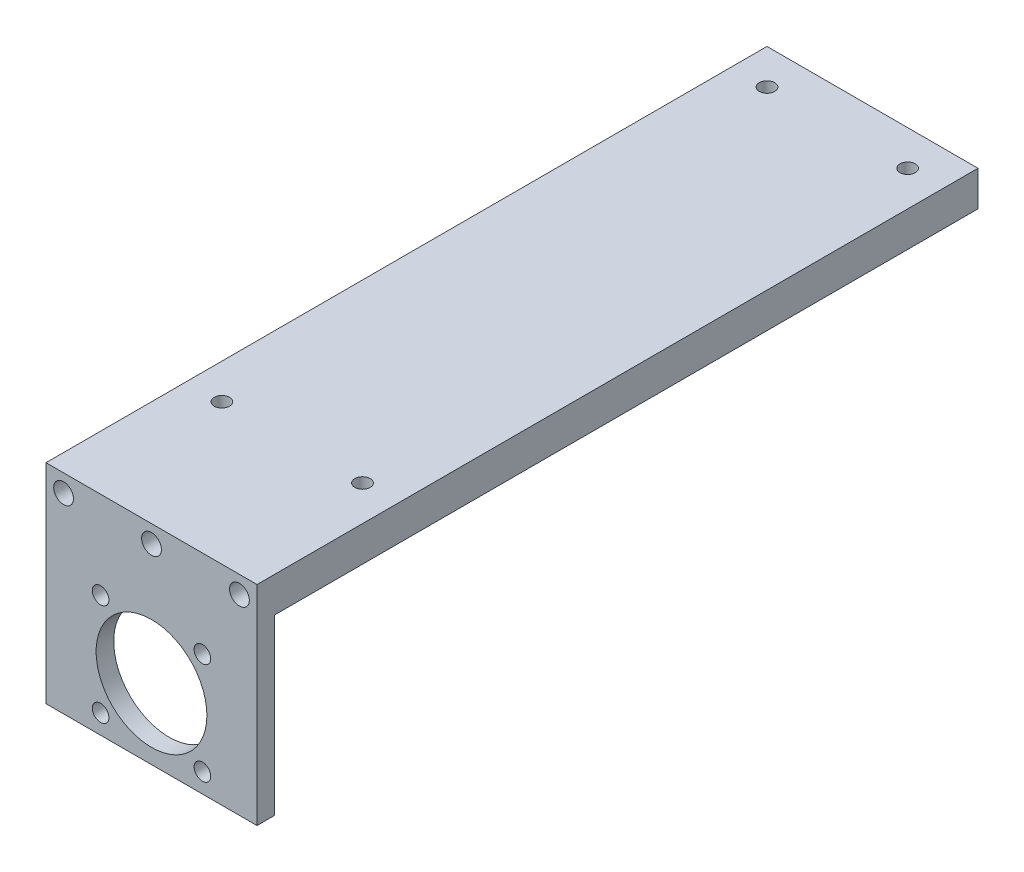
ISO-10303-21;
HEADER;
FILE_DESCRIPTION(('STEP AP214'),'2;1');
FILE_NAME('part.step','',(''),(''),'','','');
FILE_SCHEMA(('AUTOMOTIVE_DESIGN { 1 0 10303 214 1 1 1 1 }'));
ENDSEC;
DATA;
#1=APPLICATION_CONTEXT('core data for automotive mechanical design processes');
#2=APPLICATION_PROTOCOL_DEFINITION('international standard','automotive_design',2000,#1);
#3=PRODUCT_CONTEXT('',#1,'mechanical');
#4=PRODUCT('Part','Part','',(#3));
#5=PRODUCT_RELATED_PRODUCT_CATEGORY('part','',(#4));
#6=PRODUCT_DEFINITION_FORMATION('','',#4);
#7=PRODUCT_DEFINITION_CONTEXT('part definition',#1,'design');
#8=PRODUCT_DEFINITION('design','',#6,#7);
#9=PRODUCT_DEFINITION_SHAPE('','',#8);
#10=(LENGTH_UNIT() NAMED_UNIT(*) SI_UNIT(.MILLI.,.METRE.));
#11=(NAMED_UNIT(*) PLANE_ANGLE_UNIT() SI_UNIT($,.RADIAN.));
#12=(NAMED_UNIT(*) SI_UNIT($,.STERADIAN.) SOLID_ANGLE_UNIT());
#13=UNCERTAINTY_MEASURE_WITH_UNIT(LENGTH_MEASURE(1.E-05),#10,'distance_accuracy_value','');
#14=(GEOMETRIC_REPRESENTATION_CONTEXT(3) GLOBAL_UNCERTAINTY_ASSIGNED_CONTEXT((#13)) GLOBAL_UNIT_ASSIGNED_CONTEXT((#10,
#11,#12)) REPRESENTATION_CONTEXT('',''));
#15=CARTESIAN_POINT('',(0.,0.,0.));
#16=DIRECTION('',(0.,0.,1.));
#17=DIRECTION('',(1.,0.,0.));
#18=AXIS2_PLACEMENT_3D('',#15,#16,#17);
#19=CARTESIAN_POINT('',(0.,0.,3.175));
#20=DIRECTION('',(0.,0.,-1.));
#21=DIRECTION('',(-1.,0.,0.));
#22=AXIS2_PLACEMENT_3D('',#19,#20,#21);
#23=PLANE('',#22);
#24=DIRECTION('',(0.,1.,0.));
#25=VECTOR('',#24,1.);
#26=CARTESIAN_POINT('',(19.05,24.9936,3.175));
#27=LINE('',#26,#25);
#28=CARTESIAN_POINT('',(19.05,-12.7,3.175));
#29=VERTEX_POINT('',#28);
#30=CARTESIAN_POINT('',(19.05,24.9936,3.175));
#31=VERTEX_POINT('',#30);
#32=EDGE_CURVE('E196',#29,#31,#27,.T.);
#33=ORIENTED_EDGE('',*,*,#32,.T.);
#34=DIRECTION('',(-1.,0.,0.));
#35=VECTOR('',#34,1.);
#36=CARTESIAN_POINT('',(19.05,24.9936,3.175));
#37=LINE('',#36,#35);
#38=CARTESIAN_POINT('',(-19.05,24.9936,3.175));
#39=VERTEX_POINT('',#38);
#40=EDGE_CURVE('E86',#31,#39,#37,.T.);
#41=ORIENTED_EDGE('',*,*,#40,.T.);
#42=DIRECTION('',(0.,-1.,0.));
#43=VECTOR('',#42,1.);
#44=CARTESIAN_POINT('',(-19.05,24.9936,3.175));
#45=LINE('',#44,#43);
#46=CARTESIAN_POINT('',(-19.05,-12.7,3.175));
#47=VERTEX_POINT('',#46);
#48=EDGE_CURVE('E201',#39,#47,#45,.T.);
#49=ORIENTED_EDGE('',*,*,#48,.T.);
#50=DIRECTION('',(1.,0.,0.));
#51=VECTOR('',#50,1.);
#52=CARTESIAN_POINT('',(19.05,-12.7,3.175));
#53=LINE('',#52,#51);
#54=EDGE_CURVE('E64',#47,#29,#53,.T.);
#55=ORIENTED_EDGE('',*,*,#54,.T.);
#56=EDGE_LOOP('',(#33,#41,#49,#55));
#57=FACE_BOUND('',#56,.T.);
#58=CARTESIAN_POINT('',(15.875,21.8186,3.175));
#59=DIRECTION('',(0.,0.,1.));
#60=DIRECTION('',(1.,0.,0.));
#61=AXIS2_PLACEMENT_3D('',#58,#59,#60);
#62=CIRCLE('',#61,1.7859375);
#63=CARTESIAN_POINT('',(17.6609375,21.8186,3.175));
#64=VERTEX_POINT('',#63);
#65=EDGE_CURVE('E189',#64,#64,#62,.T.);
#66=ORIENTED_EDGE('',*,*,#65,.F.);
#67=EDGE_LOOP('',(#66));
#68=FACE_BOUND('',#67,.T.);
#69=CARTESIAN_POINT('',(0.,21.8186,3.175));
#70=DIRECTION('',(0.,0.,1.));
#71=DIRECTION('',(1.,0.,0.));
#72=AXIS2_PLACEMENT_3D('',#69,#70,#71);
#73=CIRCLE('',#72,1.7859375);
#74=CARTESIAN_POINT('',(1.7859375,21.8186,3.175));
#75=VERTEX_POINT('',#74);
#76=EDGE_CURVE('E181',#75,#75,#73,.T.);
#77=ORIENTED_EDGE('',*,*,#76,.F.);
#78=EDGE_LOOP('',(#77));
#79=FACE_BOUND('',#78,.T.);
#80=CARTESIAN_POINT('',(-15.875,21.8186,3.175));
#81=DIRECTION('',(0.,0.,1.));
#82=DIRECTION('',(1.,0.,0.));
#83=AXIS2_PLACEMENT_3D('',#80,#81,#82);
#84=CIRCLE('',#83,1.7859375);
#85=CARTESIAN_POINT('',(-14.0890625,21.8186,3.175));
#86=VERTEX_POINT('',#85);
#87=EDGE_CURVE('E173',#86,#86,#84,.T.);
#88=ORIENTED_EDGE('',*,*,#87,.F.);
#89=EDGE_LOOP('',(#88));
#90=FACE_BOUND('',#89,.T.);
#91=CARTESIAN_POINT('',(0.,0.,3.175));
#92=DIRECTION('',(0.,0.,1.));
#93=DIRECTION('',(1.,0.,0.));
#94=AXIS2_PLACEMENT_3D('',#91,#92,#93);
#95=CIRCLE('',#94,9.99999999999999);
#96=CARTESIAN_POINT('',(9.99999999999999,0.,3.175));
#97=VERTEX_POINT('',#96);
#98=EDGE_CURVE('E165',#97,#97,#95,.T.);
#99=ORIENTED_EDGE('',*,*,#98,.F.);
#100=EDGE_LOOP('',(#99));
#101=FACE_BOUND('',#100,.T.);
#102=CARTESIAN_POINT('',(-9.19238815542511,9.1923881554251,3.175));
#103=DIRECTION('',(0.,0.,1.));
#104=DIRECTION('',(1.,0.,0.));
#105=AXIS2_PLACEMENT_3D('',#102,#103,#104);
#106=CIRCLE('',#105,1.5);
#107=CARTESIAN_POINT('',(-7.69238815542511,9.1923881554251,3.175));
#108=VERTEX_POINT('',#107);
#109=EDGE_CURVE('E157',#108,#108,#106,.T.);
#110=ORIENTED_EDGE('',*,*,#109,.F.);
#111=EDGE_LOOP('',(#110));
#112=FACE_BOUND('',#111,.T.);
#113=CARTESIAN_POINT('',(9.19238815542512,9.19238815542512,3.175));
#114=DIRECTION('',(0.,0.,1.));
#115=DIRECTION('',(1.,0.,0.));
#116=AXIS2_PLACEMENT_3D('',#113,#114,#115);
#117=CIRCLE('',#116,1.50000000000001);
#118=CARTESIAN_POINT('',(10.6923881554251,9.19238815542512,3.175));
#119=VERTEX_POINT('',#118);
#120=EDGE_CURVE('E149',#119,#119,#117,.T.);
#121=ORIENTED_EDGE('',*,*,#120,.F.);
#122=EDGE_LOOP('',(#121));
#123=FACE_BOUND('',#122,.T.);
#124=CARTESIAN_POINT('',(9.19238815542513,-9.19238815542513,3.175));
#125=DIRECTION('',(0.,0.,1.));
#126=DIRECTION('',(1.,0.,0.));
#127=AXIS2_PLACEMENT_3D('',#124,#125,#126);
#128=CIRCLE('',#127,1.50000000000001);
#129=CARTESIAN_POINT('',(10.6923881554251,-9.19238815542513,3.175));
#130=VERTEX_POINT('',#129);
#131=EDGE_CURVE('E141',#130,#130,#128,.T.);
#132=ORIENTED_EDGE('',*,*,#131,.F.);
#133=EDGE_LOOP('',(#132));
#134=FACE_BOUND('',#133,.T.);
#135=CARTESIAN_POINT('',(-9.19238815542511,-9.19238815542513,3.175));
#136=DIRECTION('',(0.,0.,1.));
#137=DIRECTION('',(1.,0.,0.));
#138=AXIS2_PLACEMENT_3D('',#135,#136,#137);
#139=CIRCLE('',#138,1.5);
#140=CARTESIAN_POINT('',(-7.69238815542511,-9.19238815542513,3.175));
#141=VERTEX_POINT('',#140);
#142=EDGE_CURVE('E132',#141,#141,#139,.T.);
#143=ORIENTED_EDGE('',*,*,#142,.F.);
#144=EDGE_LOOP('',(#143));
#145=FACE_BOUND('',#144,.T.);
#146=ADVANCED_FACE('F39',(#57,#68,#79,#90,#101,#112,#123,#134,#145),#23,.F.);
#147=CARTESIAN_POINT('',(0.,0.,0.));
#148=DIRECTION('',(0.,0.,-1.));
#149=DIRECTION('',(-1.,0.,0.));
#150=AXIS2_PLACEMENT_3D('',#147,#148,#149);
#151=PLANE('',#150);
#152=DIRECTION('',(-1.,0.,0.));
#153=VECTOR('',#152,1.);
#154=CARTESIAN_POINT('',(19.05,18.6436,0.));
#155=LINE('',#154,#153);
#156=CARTESIAN_POINT('',(19.05,18.6436,0.));
#157=VERTEX_POINT('',#156);
#158=CARTESIAN_POINT('',(-19.05,18.6436,0.));
#159=VERTEX_POINT('',#158);
#160=EDGE_CURVE('E55',#157,#159,#155,.T.);
#161=ORIENTED_EDGE('',*,*,#160,.F.);
#162=DIRECTION('',(0.,1.,0.));
#163=VECTOR('',#162,1.);
#164=CARTESIAN_POINT('',(19.05,24.9936,0.));
#165=LINE('',#164,#163);
#166=CARTESIAN_POINT('',(19.05,-12.7,0.));
#167=VERTEX_POINT('',#166);
#168=EDGE_CURVE('E125',#167,#157,#165,.T.);
#169=ORIENTED_EDGE('',*,*,#168,.F.);
#170=DIRECTION('',(1.,0.,0.));
#171=VECTOR('',#170,1.);
#172=CARTESIAN_POINT('',(19.05,-12.7,0.));
#173=LINE('',#172,#171);
#174=CARTESIAN_POINT('',(-19.05,-12.7,0.));
#175=VERTEX_POINT('',#174);
#176=EDGE_CURVE('E79',#175,#167,#173,.T.);
#177=ORIENTED_EDGE('',*,*,#176,.F.);
#178=DIRECTION('',(0.,-1.,0.));
#179=VECTOR('',#178,1.);
#180=CARTESIAN_POINT('',(-19.05,24.9936,0.));
#181=LINE('',#180,#179);
#182=EDGE_CURVE('E209',#159,#175,#181,.T.);
#183=ORIENTED_EDGE('',*,*,#182,.F.);
#184=EDGE_LOOP('',(#161,#169,#177,#183));
#185=FACE_BOUND('',#184,.T.);
#186=CARTESIAN_POINT('',(9.19238815542513,-9.19238815542513,0.));
#187=DIRECTION('',(0.,0.,1.));
#188=DIRECTION('',(1.,0.,0.));
#189=AXIS2_PLACEMENT_3D('',#186,#187,#188);
#190=CIRCLE('',#189,1.50000000000001);
#191=CARTESIAN_POINT('',(10.6923881554251,-9.19238815542513,0.));
#192=VERTEX_POINT('',#191);
#193=EDGE_CURVE('E139',#192,#192,#190,.T.);
#194=ORIENTED_EDGE('',*,*,#193,.T.);
#195=EDGE_LOOP('',(#194));
#196=FACE_BOUND('',#195,.T.);
#197=CARTESIAN_POINT('',(-9.19238815542511,9.1923881554251,0.));
#198=DIRECTION('',(0.,0.,1.));
#199=DIRECTION('',(1.,0.,0.));
#200=AXIS2_PLACEMENT_3D('',#197,#198,#199);
#201=CIRCLE('',#200,1.5);
#202=CARTESIAN_POINT('',(-7.69238815542511,9.1923881554251,0.));
#203=VERTEX_POINT('',#202);
#204=EDGE_CURVE('E153',#203,#203,#201,.T.);
#205=ORIENTED_EDGE('',*,*,#204,.T.);
#206=EDGE_LOOP('',(#205));
#207=FACE_BOUND('',#206,.T.);
#208=CARTESIAN_POINT('',(0.,0.,0.));
#209=DIRECTION('',(0.,0.,1.));
#210=DIRECTION('',(1.,0.,0.));
#211=AXIS2_PLACEMENT_3D('',#208,#209,#210);
#212=CIRCLE('',#211,9.99999999999999);
#213=CARTESIAN_POINT('',(9.99999999999999,0.,0.));
#214=VERTEX_POINT('',#213);
#215=EDGE_CURVE('E161',#214,#214,#212,.T.);
#216=ORIENTED_EDGE('',*,*,#215,.T.);
#217=EDGE_LOOP('',(#216));
#218=FACE_BOUND('',#217,.T.);
#219=CARTESIAN_POINT('',(9.19238815542512,9.19238815542512,0.));
#220=DIRECTION('',(0.,0.,1.));
#221=DIRECTION('',(1.,0.,0.));
#222=AXIS2_PLACEMENT_3D('',#219,#220,#221);
#223=CIRCLE('',#222,1.50000000000001);
#224=CARTESIAN_POINT('',(10.6923881554251,9.19238815542512,0.));
#225=VERTEX_POINT('',#224);
#226=EDGE_CURVE('E145',#225,#225,#223,.T.);
#227=ORIENTED_EDGE('',*,*,#226,.T.);
#228=EDGE_LOOP('',(#227));
#229=FACE_BOUND('',#228,.T.);
#230=CARTESIAN_POINT('',(-9.19238815542511,-9.19238815542513,0.));
#231=DIRECTION('',(0.,0.,1.));
#232=DIRECTION('',(1.,0.,0.));
#233=AXIS2_PLACEMENT_3D('',#230,#231,#232);
#234=CIRCLE('',#233,1.5);
#235=CARTESIAN_POINT('',(-7.69238815542511,-9.19238815542513,0.));
#236=VERTEX_POINT('',#235);
#237=EDGE_CURVE('E127',#236,#236,#234,.T.);
#238=ORIENTED_EDGE('',*,*,#237,.T.);
#239=EDGE_LOOP('',(#238));
#240=FACE_BOUND('',#239,.T.);
#241=ADVANCED_FACE('F290',(#185,#196,#207,#218,#229,#240),#151,.T.);
#242=CARTESIAN_POINT('',(19.05,24.9936,3.175));
#243=DIRECTION('',(-1.,0.,0.));
#244=DIRECTION('',(0.,-1.,0.));
#245=AXIS2_PLACEMENT_3D('',#242,#243,#244);
#246=PLANE('',#245);
#247=ORIENTED_EDGE('',*,*,#168,.T.);
#248=DIRECTION('',(0.,0.,1.));
#249=VECTOR('',#248,1.);
#250=CARTESIAN_POINT('',(19.05,18.6436,-127.));
#251=LINE('',#250,#249);
#252=CARTESIAN_POINT('',(19.05,18.6436,-127.));
#253=VERTEX_POINT('',#252);
#254=EDGE_CURVE('E106',#253,#157,#251,.T.);
#255=ORIENTED_EDGE('',*,*,#254,.F.);
#256=DIRECTION('',(0.,-1.,0.));
#257=VECTOR('',#256,1.);
#258=CARTESIAN_POINT('',(19.05,24.9936,-127.));
#259=LINE('',#258,#257);
#260=CARTESIAN_POINT('',(19.05,24.9936,-127.));
#261=VERTEX_POINT('',#260);
#262=EDGE_CURVE('E114',#261,#253,#259,.T.);
#263=ORIENTED_EDGE('',*,*,#262,.F.);
#264=DIRECTION('',(0.,0.,-1.));
#265=VECTOR('',#264,1.);
#266=CARTESIAN_POINT('',(19.05,24.9936,3.175));
#267=LINE('',#266,#265);
#268=EDGE_CURVE('E11',#31,#261,#267,.T.);
#269=ORIENTED_EDGE('',*,*,#268,.F.);
#270=ORIENTED_EDGE('',*,*,#32,.F.);
#271=DIRECTION('',(0.,0.,-1.));
#272=VECTOR('',#271,1.);
#273=CARTESIAN_POINT('',(19.05,-12.7,3.175));
#274=LINE('',#273,#272);
#275=EDGE_CURVE('E206',#29,#167,#274,.T.);
#276=ORIENTED_EDGE('',*,*,#275,.T.);
#277=EDGE_LOOP('',(#247,#255,#263,#269,#270,#276));
#278=FACE_BOUND('',#277,.T.);
#279=ADVANCED_FACE('F41',(#278),#246,.F.);
#280=CARTESIAN_POINT('',(19.05,24.9936,3.175));
#281=DIRECTION('',(0.,-1.,0.));
#282=DIRECTION('',(1.,0.,0.));
#283=AXIS2_PLACEMENT_3D('',#280,#281,#282);
#284=PLANE('',#283);
#285=CARTESIAN_POINT('',(12.7,24.9936,-120.65));
#286=DIRECTION('',(0.,1.,0.));
#287=DIRECTION('',(-1.,0.,0.));
#288=AXIS2_PLACEMENT_3D('',#285,#286,#287);
#289=CIRCLE('',#288,1.3890625);
#290=CARTESIAN_POINT('',(11.3109375,24.9936,-120.65));
#291=VERTEX_POINT('',#290);
#292=EDGE_CURVE('E245',#291,#291,#289,.T.);
#293=ORIENTED_EDGE('',*,*,#292,.F.);
#294=EDGE_LOOP('',(#293));
#295=FACE_BOUND('',#294,.T.);
#296=CARTESIAN_POINT('',(-12.7,24.9936,-22.225));
#297=DIRECTION('',(0.,1.,0.));
#298=DIRECTION('',(-1.,0.,0.));
#299=AXIS2_PLACEMENT_3D('',#296,#297,#298);
#300=CIRCLE('',#299,1.3890625);
#301=CARTESIAN_POINT('',(-14.0890625,24.9936,-22.225));
#302=VERTEX_POINT('',#301);
#303=EDGE_CURVE('E246',#302,#302,#300,.T.);
#304=ORIENTED_EDGE('',*,*,#303,.F.);
#305=EDGE_LOOP('',(#304));
#306=FACE_BOUND('',#305,.T.);
#307=CARTESIAN_POINT('',(12.7,24.9936,-22.225));
#308=DIRECTION('',(0.,1.,0.));
#309=DIRECTION('',(-1.,0.,0.));
#310=AXIS2_PLACEMENT_3D('',#307,#308,#309);
#311=CIRCLE('',#310,1.3890625);
#312=CARTESIAN_POINT('',(11.3109375,24.9936,-22.225));
#313=VERTEX_POINT('',#312);
#314=EDGE_CURVE('E260',#313,#313,#311,.T.);
#315=ORIENTED_EDGE('',*,*,#314,.F.);
#316=EDGE_LOOP('',(#315));
#317=FACE_BOUND('',#316,.T.);
#318=CARTESIAN_POINT('',(-12.7,24.9936,-120.65));
#319=DIRECTION('',(0.,1.,0.));
#320=DIRECTION('',(-1.,0.,0.));
#321=AXIS2_PLACEMENT_3D('',#318,#319,#320);
#322=CIRCLE('',#321,1.3890625);
#323=CARTESIAN_POINT('',(-14.0890625,24.9936,-120.65));
#324=VERTEX_POINT('',#323);
#325=EDGE_CURVE('E232',#324,#324,#322,.T.);
#326=ORIENTED_EDGE('',*,*,#325,.F.);
#327=EDGE_LOOP('',(#326));
#328=FACE_BOUND('',#327,.T.);
#329=ORIENTED_EDGE('',*,*,#268,.T.);
#330=DIRECTION('',(1.,0.,0.));
#331=VECTOR('',#330,1.);
#332=CARTESIAN_POINT('',(19.05,24.9936,-127.));
#333=LINE('',#332,#331);
#334=CARTESIAN_POINT('',(-19.05,24.9936,-127.));
#335=VERTEX_POINT('',#334);
#336=EDGE_CURVE('E120',#335,#261,#333,.T.);
#337=ORIENTED_EDGE('',*,*,#336,.F.);
#338=DIRECTION('',(0.,0.,-1.));
#339=VECTOR('',#338,1.);
#340=CARTESIAN_POINT('',(-19.05,24.9936,3.175));
#341=LINE('',#340,#339);
#342=EDGE_CURVE('E48',#39,#335,#341,.T.);
#343=ORIENTED_EDGE('',*,*,#342,.F.);
#344=ORIENTED_EDGE('',*,*,#40,.F.);
#345=EDGE_LOOP('',(#329,#337,#343,#344));
#346=FACE_BOUND('',#345,.T.);
#347=ADVANCED_FACE('F225',(#295,#306,#317,#328,#346),#284,.F.);
#348=CARTESIAN_POINT('',(-19.05,24.9936,3.175));
#349=DIRECTION('',(1.,0.,0.));
#350=DIRECTION('',(0.,1.,0.));
#351=AXIS2_PLACEMENT_3D('',#348,#349,#350);
#352=PLANE('',#351);
#353=ORIENTED_EDGE('',*,*,#342,.T.);
#354=DIRECTION('',(0.,1.,0.));
#355=VECTOR('',#354,1.);
#356=CARTESIAN_POINT('',(-19.05,24.9936,-127.));
#357=LINE('',#356,#355);
#358=CARTESIAN_POINT('',(-19.05,18.6436,-127.));
#359=VERTEX_POINT('',#358);
#360=EDGE_CURVE('E113',#359,#335,#357,.T.);
#361=ORIENTED_EDGE('',*,*,#360,.F.);
#362=DIRECTION('',(0.,0.,1.));
#363=VECTOR('',#362,1.);
#364=CARTESIAN_POINT('',(-19.05,18.6436,-127.));
#365=LINE('',#364,#363);
#366=EDGE_CURVE('E108',#359,#159,#365,.T.);
#367=ORIENTED_EDGE('',*,*,#366,.T.);
#368=ORIENTED_EDGE('',*,*,#182,.T.);
#369=DIRECTION('',(0.,0.,-1.));
#370=VECTOR('',#369,1.);
#371=CARTESIAN_POINT('',(-19.05,-12.7,3.175));
#372=LINE('',#371,#370);
#373=EDGE_CURVE('E216',#47,#175,#372,.T.);
#374=ORIENTED_EDGE('',*,*,#373,.F.);
#375=ORIENTED_EDGE('',*,*,#48,.F.);
#376=EDGE_LOOP('',(#353,#361,#367,#368,#374,#375));
#377=FACE_BOUND('',#376,.T.);
#378=ADVANCED_FACE('F221',(#377),#352,.F.);
#379=CARTESIAN_POINT('',(19.05,-12.7,3.175));
#380=DIRECTION('',(0.,1.,0.));
#381=DIRECTION('',(-1.,0.,0.));
#382=AXIS2_PLACEMENT_3D('',#379,#380,#381);
#383=PLANE('',#382);
#384=ORIENTED_EDGE('',*,*,#176,.T.);
#385=ORIENTED_EDGE('',*,*,#275,.F.);
#386=ORIENTED_EDGE('',*,*,#54,.F.);
#387=ORIENTED_EDGE('',*,*,#373,.T.);
#388=EDGE_LOOP('',(#384,#385,#386,#387));
#389=FACE_BOUND('',#388,.T.);
#390=ADVANCED_FACE('F302',(#389),#383,.F.);
#391=CARTESIAN_POINT('',(15.875,21.8186,3.175));
#392=DIRECTION('',(0.,0.,-1.));
#393=DIRECTION('',(-1.,0.,0.));
#394=AXIS2_PLACEMENT_3D('',#391,#392,#393);
#395=CYLINDRICAL_SURFACE('',#394,1.7859375);
#396=ORIENTED_EDGE('',*,*,#65,.T.);
#397=EDGE_LOOP('',(#396));
#398=FACE_BOUND('',#397,.T.);
#399=CARTESIAN_POINT('',(15.875,21.8186,0.));
#400=DIRECTION('',(0.,0.,1.));
#401=DIRECTION('',(1.,0.,0.));
#402=AXIS2_PLACEMENT_3D('',#399,#400,#401);
#403=CIRCLE('',#402,1.7859375);
#404=CARTESIAN_POINT('',(17.6609375,21.8186,0.));
#405=VERTEX_POINT('',#404);
#406=EDGE_CURVE('E185',#405,#405,#403,.T.);
#407=ORIENTED_EDGE('',*,*,#406,.F.);
#408=EDGE_LOOP('',(#407));
#409=FACE_BOUND('',#408,.T.);
#410=ADVANCED_FACE('F299',(#398,#409),#395,.F.);
#411=CARTESIAN_POINT('',(0.,21.8186,3.175));
#412=DIRECTION('',(0.,0.,-1.));
#413=DIRECTION('',(-1.,0.,0.));
#414=AXIS2_PLACEMENT_3D('',#411,#412,#413);
#415=CYLINDRICAL_SURFACE('',#414,1.7859375);
#416=ORIENTED_EDGE('',*,*,#76,.T.);
#417=EDGE_LOOP('',(#416));
#418=FACE_BOUND('',#417,.T.);
#419=CARTESIAN_POINT('',(0.,21.8186,0.));
#420=DIRECTION('',(0.,0.,1.));
#421=DIRECTION('',(1.,0.,0.));
#422=AXIS2_PLACEMENT_3D('',#419,#420,#421);
#423=CIRCLE('',#422,1.7859375);
#424=CARTESIAN_POINT('',(1.7859375,21.8186,0.));
#425=VERTEX_POINT('',#424);
#426=EDGE_CURVE('E177',#425,#425,#423,.T.);
#427=ORIENTED_EDGE('',*,*,#426,.F.);
#428=EDGE_LOOP('',(#427));
#429=FACE_BOUND('',#428,.T.);
#430=ADVANCED_FACE('F382',(#418,#429),#415,.F.);
#431=CARTESIAN_POINT('',(-15.875,21.8186,3.175));
#432=DIRECTION('',(0.,0.,-1.));
#433=DIRECTION('',(-1.,0.,0.));
#434=AXIS2_PLACEMENT_3D('',#431,#432,#433);
#435=CYLINDRICAL_SURFACE('',#434,1.7859375);
#436=ORIENTED_EDGE('',*,*,#87,.T.);
#437=EDGE_LOOP('',(#436));
#438=FACE_BOUND('',#437,.T.);
#439=CARTESIAN_POINT('',(-15.875,21.8186,0.));
#440=DIRECTION('',(0.,0.,1.));
#441=DIRECTION('',(1.,0.,0.));
#442=AXIS2_PLACEMENT_3D('',#439,#440,#441);
#443=CIRCLE('',#442,1.7859375);
#444=CARTESIAN_POINT('',(-14.0890625,21.8186,0.));
#445=VERTEX_POINT('',#444);
#446=EDGE_CURVE('E169',#445,#445,#443,.T.);
#447=ORIENTED_EDGE('',*,*,#446,.F.);
#448=EDGE_LOOP('',(#447));
#449=FACE_BOUND('',#448,.T.);
#450=ADVANCED_FACE('F390',(#438,#449),#435,.F.);
#451=CARTESIAN_POINT('',(0.,0.,3.175));
#452=DIRECTION('',(0.,0.,-1.));
#453=DIRECTION('',(-1.,0.,0.));
#454=AXIS2_PLACEMENT_3D('',#451,#452,#453);
#455=CYLINDRICAL_SURFACE('',#454,9.99999999999999);
#456=ORIENTED_EDGE('',*,*,#98,.T.);
#457=EDGE_LOOP('',(#456));
#458=FACE_BOUND('',#457,.T.);
#459=ORIENTED_EDGE('',*,*,#215,.F.);
#460=EDGE_LOOP('',(#459));
#461=FACE_BOUND('',#460,.T.);
#462=ADVANCED_FACE('F398',(#458,#461),#455,.F.);
#463=CARTESIAN_POINT('',(-9.19238815542511,9.1923881554251,3.175));
#464=DIRECTION('',(0.,0.,-1.));
#465=DIRECTION('',(-1.,0.,0.));
#466=AXIS2_PLACEMENT_3D('',#463,#464,#465);
#467=CYLINDRICAL_SURFACE('',#466,1.5);
#468=ORIENTED_EDGE('',*,*,#109,.T.);
#469=EDGE_LOOP('',(#468));
#470=FACE_BOUND('',#469,.T.);
#471=ORIENTED_EDGE('',*,*,#204,.F.);
#472=EDGE_LOOP('',(#471));
#473=FACE_BOUND('',#472,.T.);
#474=ADVANCED_FACE('F407',(#470,#473),#467,.F.);
#475=CARTESIAN_POINT('',(9.19238815542512,9.19238815542512,3.175));
#476=DIRECTION('',(0.,0.,-1.));
#477=DIRECTION('',(-1.,0.,0.));
#478=AXIS2_PLACEMENT_3D('',#475,#476,#477);
#479=CYLINDRICAL_SURFACE('',#478,1.50000000000001);
#480=ORIENTED_EDGE('',*,*,#120,.T.);
#481=EDGE_LOOP('',(#480));
#482=FACE_BOUND('',#481,.T.);
#483=ORIENTED_EDGE('',*,*,#226,.F.);
#484=EDGE_LOOP('',(#483));
#485=FACE_BOUND('',#484,.T.);
#486=ADVANCED_FACE('F416',(#482,#485),#479,.F.);
#487=CARTESIAN_POINT('',(9.19238815542513,-9.19238815542513,3.175));
#488=DIRECTION('',(0.,0.,-1.));
#489=DIRECTION('',(-1.,0.,0.));
#490=AXIS2_PLACEMENT_3D('',#487,#488,#489);
#491=CYLINDRICAL_SURFACE('',#490,1.50000000000001);
#492=ORIENTED_EDGE('',*,*,#131,.T.);
#493=EDGE_LOOP('',(#492));
#494=FACE_BOUND('',#493,.T.);
#495=ORIENTED_EDGE('',*,*,#193,.F.);
#496=EDGE_LOOP('',(#495));
#497=FACE_BOUND('',#496,.T.);
#498=ADVANCED_FACE('F425',(#494,#497),#491,.F.);
#499=CARTESIAN_POINT('',(-9.19238815542511,-9.19238815542513,3.175));
#500=DIRECTION('',(0.,0.,-1.));
#501=DIRECTION('',(-1.,0.,0.));
#502=AXIS2_PLACEMENT_3D('',#499,#500,#501);
#503=CYLINDRICAL_SURFACE('',#502,1.5);
#504=ORIENTED_EDGE('',*,*,#142,.T.);
#505=EDGE_LOOP('',(#504));
#506=FACE_BOUND('',#505,.T.);
#507=ORIENTED_EDGE('',*,*,#237,.F.);
#508=EDGE_LOOP('',(#507));
#509=FACE_BOUND('',#508,.T.);
#510=ADVANCED_FACE('F318',(#506,#509),#503,.F.);
#511=CARTESIAN_POINT('',(0.,0.,-127.));
#512=DIRECTION('',(0.,0.,-1.));
#513=DIRECTION('',(-1.,0.,0.));
#514=AXIS2_PLACEMENT_3D('',#511,#512,#513);
#515=PLANE('',#514);
#516=ORIENTED_EDGE('',*,*,#262,.T.);
#517=DIRECTION('',(-1.,0.,0.));
#518=VECTOR('',#517,1.);
#519=CARTESIAN_POINT('',(19.05,18.6436,-127.));
#520=LINE('',#519,#518);
#521=EDGE_CURVE('E102',#253,#359,#520,.T.);
#522=ORIENTED_EDGE('',*,*,#521,.T.);
#523=ORIENTED_EDGE('',*,*,#360,.T.);
#524=ORIENTED_EDGE('',*,*,#336,.T.);
#525=EDGE_LOOP('',(#516,#522,#523,#524));
#526=FACE_BOUND('',#525,.T.);
#527=ADVANCED_FACE('F118',(#526),#515,.T.);
#528=CARTESIAN_POINT('',(19.05,18.6436,-127.));
#529=DIRECTION('',(0.,1.,0.));
#530=DIRECTION('',(0.,0.,1.));
#531=AXIS2_PLACEMENT_3D('',#528,#529,#530);
#532=PLANE('',#531);
#533=CARTESIAN_POINT('',(12.7,18.6436,-120.65));
#534=DIRECTION('',(0.,1.,0.));
#535=DIRECTION('',(0.,0.,1.));
#536=AXIS2_PLACEMENT_3D('',#533,#534,#535);
#537=CIRCLE('',#536,1.3890625);
#538=CARTESIAN_POINT('',(12.7,18.6436,-119.2609375));
#539=VERTEX_POINT('',#538);
#540=EDGE_CURVE('E238',#539,#539,#537,.F.);
#541=ORIENTED_EDGE('',*,*,#540,.F.);
#542=EDGE_LOOP('',(#541));
#543=FACE_BOUND('',#542,.T.);
#544=CARTESIAN_POINT('',(-12.7,18.6436,-22.225));
#545=DIRECTION('',(0.,1.,0.));
#546=DIRECTION('',(0.,0.,1.));
#547=AXIS2_PLACEMENT_3D('',#544,#545,#546);
#548=CIRCLE('',#547,1.3890625);
#549=CARTESIAN_POINT('',(-12.7,18.6436,-20.8359375));
#550=VERTEX_POINT('',#549);
#551=EDGE_CURVE('E241',#550,#550,#548,.F.);
#552=ORIENTED_EDGE('',*,*,#551,.F.);
#553=EDGE_LOOP('',(#552));
#554=FACE_BOUND('',#553,.T.);
#555=CARTESIAN_POINT('',(12.7,18.6436,-22.225));
#556=DIRECTION('',(0.,1.,0.));
#557=DIRECTION('',(0.,0.,1.));
#558=AXIS2_PLACEMENT_3D('',#555,#556,#557);
#559=CIRCLE('',#558,1.3890625);
#560=CARTESIAN_POINT('',(12.7,18.6436,-20.8359375));
#561=VERTEX_POINT('',#560);
#562=EDGE_CURVE('E250',#561,#561,#559,.F.);
#563=ORIENTED_EDGE('',*,*,#562,.F.);
#564=EDGE_LOOP('',(#563));
#565=FACE_BOUND('',#564,.T.);
#566=CARTESIAN_POINT('',(-12.7,18.6436,-120.65));
#567=DIRECTION('',(0.,1.,0.));
#568=DIRECTION('',(0.,0.,1.));
#569=AXIS2_PLACEMENT_3D('',#566,#567,#568);
#570=CIRCLE('',#569,1.3890625);
#571=CARTESIAN_POINT('',(-12.7,18.6436,-119.2609375));
#572=VERTEX_POINT('',#571);
#573=EDGE_CURVE('E229',#572,#572,#570,.F.);
#574=ORIENTED_EDGE('',*,*,#573,.F.);
#575=EDGE_LOOP('',(#574));
#576=FACE_BOUND('',#575,.T.);
#577=ORIENTED_EDGE('',*,*,#160,.T.);
#578=ORIENTED_EDGE('',*,*,#366,.F.);
#579=ORIENTED_EDGE('',*,*,#521,.F.);
#580=ORIENTED_EDGE('',*,*,#254,.T.);
#581=EDGE_LOOP('',(#577,#578,#579,#580));
#582=FACE_BOUND('',#581,.T.);
#583=ADVANCED_FACE('F104',(#543,#554,#565,#576,#582),#532,.F.);
#584=CARTESIAN_POINT('',(0.,0.,0.));
#585=DIRECTION('',(0.,0.,-1.));
#586=DIRECTION('',(-1.,0.,0.));
#587=AXIS2_PLACEMENT_3D('',#584,#585,#586);
#588=PLANE('',#587);
#589=ORIENTED_EDGE('',*,*,#426,.T.);
#590=EDGE_LOOP('',(#589));
#591=FACE_BOUND('',#590,.T.);
#592=ADVANCED_FACE('F286',(#591),#588,.F.);
#593=ORIENTED_EDGE('',*,*,#406,.T.);
#594=EDGE_LOOP('',(#593));
#595=FACE_BOUND('',#594,.T.);
#596=ADVANCED_FACE('F283',(#595),#588,.F.);
#597=ORIENTED_EDGE('',*,*,#446,.T.);
#598=EDGE_LOOP('',(#597));
#599=FACE_BOUND('',#598,.T.);
#600=ADVANCED_FACE('F275',(#599),#588,.F.);
#601=CARTESIAN_POINT('',(-12.7,-12.701,-120.65));
#602=DIRECTION('',(0.,1.,0.));
#603=DIRECTION('',(-1.,0.,0.));
#604=AXIS2_PLACEMENT_3D('',#601,#602,#603);
#605=CYLINDRICAL_SURFACE('',#604,1.3890625);
#606=ORIENTED_EDGE('',*,*,#325,.T.);
#607=EDGE_LOOP('',(#606));
#608=FACE_BOUND('',#607,.T.);
#609=ORIENTED_EDGE('',*,*,#573,.T.);
#610=EDGE_LOOP('',(#609));
#611=FACE_BOUND('',#610,.T.);
#612=ADVANCED_FACE('F273',(#608,#611),#605,.F.);
#613=CARTESIAN_POINT('',(12.7,-12.701,-22.225));
#614=DIRECTION('',(0.,1.,0.));
#615=DIRECTION('',(-1.,0.,0.));
#616=AXIS2_PLACEMENT_3D('',#613,#614,#615);
#617=CYLINDRICAL_SURFACE('',#616,1.3890625);
#618=ORIENTED_EDGE('',*,*,#314,.T.);
#619=EDGE_LOOP('',(#618));
#620=FACE_BOUND('',#619,.T.);
#621=ORIENTED_EDGE('',*,*,#562,.T.);
#622=EDGE_LOOP('',(#621));
#623=FACE_BOUND('',#622,.T.);
#624=ADVANCED_FACE('F265',(#620,#623),#617,.F.);
#625=CARTESIAN_POINT('',(-12.7,-12.701,-22.225));
#626=DIRECTION('',(0.,1.,0.));
#627=DIRECTION('',(-1.,0.,0.));
#628=AXIS2_PLACEMENT_3D('',#625,#626,#627);
#629=CYLINDRICAL_SURFACE('',#628,1.3890625);
#630=ORIENTED_EDGE('',*,*,#303,.T.);
#631=EDGE_LOOP('',(#630));
#632=FACE_BOUND('',#631,.T.);
#633=ORIENTED_EDGE('',*,*,#551,.T.);
#634=EDGE_LOOP('',(#633));
#635=FACE_BOUND('',#634,.T.);
#636=ADVANCED_FACE('F281',(#632,#635),#629,.F.);
#637=CARTESIAN_POINT('',(12.7,-12.701,-120.65));
#638=DIRECTION('',(0.,1.,0.));
#639=DIRECTION('',(-1.,0.,0.));
#640=AXIS2_PLACEMENT_3D('',#637,#638,#639);
#641=CYLINDRICAL_SURFACE('',#640,1.3890625);
#642=ORIENTED_EDGE('',*,*,#292,.T.);
#643=EDGE_LOOP('',(#642));
#644=FACE_BOUND('',#643,.T.);
#645=ORIENTED_EDGE('',*,*,#540,.T.);
#646=EDGE_LOOP('',(#645));
#647=FACE_BOUND('',#646,.T.);
#648=ADVANCED_FACE('F515',(#644,#647),#641,.F.);
#649=CLOSED_SHELL('',(#146,#241,#279,#347,#378,#390,#410,#430,#450,#462,#474,#486,#498,#510,
#527,#583,#592,#596,#600,#612,#624,#636,#648));
#650=MANIFOLD_SOLID_BREP('B2',#649);
#651=ADVANCED_BREP_SHAPE_REPRESENTATION('',(#18,#650),#14);
#652=SHAPE_DEFINITION_REPRESENTATION(#9,#651);
ENDSEC;
END-ISO-10303-21;
